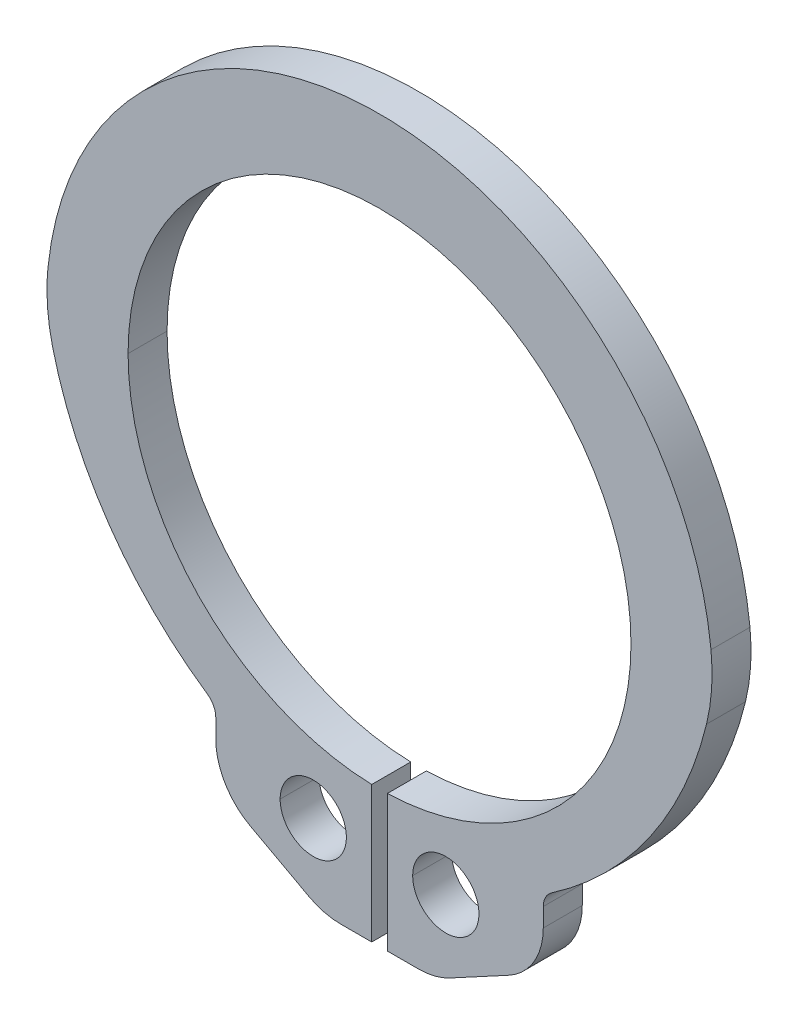
ISO-10303-21;
HEADER;
FILE_DESCRIPTION(('STEP AP214'),'2;1');
FILE_NAME('part.step','',(''),(''),'','','');
FILE_SCHEMA(('AUTOMOTIVE_DESIGN { 1 0 10303 214 1 1 1 1 }'));
ENDSEC;
DATA;
#1=APPLICATION_CONTEXT('core data for automotive mechanical design processes');
#2=APPLICATION_PROTOCOL_DEFINITION('international standard','automotive_design',2000,#1);
#3=PRODUCT_CONTEXT('',#1,'mechanical');
#4=PRODUCT('Part','Part','',(#3));
#5=PRODUCT_RELATED_PRODUCT_CATEGORY('part','',(#4));
#6=PRODUCT_DEFINITION_FORMATION('','',#4);
#7=PRODUCT_DEFINITION_CONTEXT('part definition',#1,'design');
#8=PRODUCT_DEFINITION('design','',#6,#7);
#9=PRODUCT_DEFINITION_SHAPE('','',#8);
#10=(LENGTH_UNIT() NAMED_UNIT(*) SI_UNIT(.MILLI.,.METRE.));
#11=(NAMED_UNIT(*) PLANE_ANGLE_UNIT() SI_UNIT($,.RADIAN.));
#12=(NAMED_UNIT(*) SI_UNIT($,.STERADIAN.) SOLID_ANGLE_UNIT());
#13=UNCERTAINTY_MEASURE_WITH_UNIT(LENGTH_MEASURE(1.E-05),#10,'distance_accuracy_value','');
#14=(GEOMETRIC_REPRESENTATION_CONTEXT(3) GLOBAL_UNCERTAINTY_ASSIGNED_CONTEXT((#13)) GLOBAL_UNIT_ASSIGNED_CONTEXT((#10,
#11,#12)) REPRESENTATION_CONTEXT('',''));
#15=CARTESIAN_POINT('',(0.,0.,0.));
#16=DIRECTION('',(0.,0.,1.));
#17=DIRECTION('',(1.,0.,0.));
#18=AXIS2_PLACEMENT_3D('',#15,#16,#17);
#19=CARTESIAN_POINT('',(0.,0.,-0.5));
#20=DIRECTION('',(0.,0.,1.));
#21=DIRECTION('',(1.,0.,0.));
#22=AXIS2_PLACEMENT_3D('',#19,#20,#21);
#23=PLANE('',#22);
#24=CARTESIAN_POINT('',(1.7,-7.94689847911381,-0.5));
#25=DIRECTION('',(0.,0.,1.));
#26=DIRECTION('',(1.,0.,0.));
#27=AXIS2_PLACEMENT_3D('',#24,#25,#26);
#28=CIRCLE('',#27,0.85);
#29=CARTESIAN_POINT('',(0.85,-7.94689847911381,-0.5));
#30=VERTEX_POINT('',#29);
#31=CARTESIAN_POINT('',(2.55,-7.94689847911381,-0.5));
#32=VERTEX_POINT('',#31);
#33=EDGE_CURVE('E394',#30,#32,#28,.T.);
#34=ORIENTED_EDGE('',*,*,#33,.T.);
#35=CARTESIAN_POINT('',(1.7,-7.94689847911381,-0.5));
#36=DIRECTION('',(0.,0.,1.));
#37=DIRECTION('',(1.,0.,0.));
#38=AXIS2_PLACEMENT_3D('',#35,#36,#37);
#39=CIRCLE('',#38,0.85);
#40=EDGE_CURVE('E322',#32,#30,#39,.T.);
#41=ORIENTED_EDGE('',*,*,#40,.T.);
#42=EDGE_LOOP('',(#34,#41));
#43=FACE_BOUND('',#42,.T.);
#44=CARTESIAN_POINT('',(-1.7,-7.94689847911381,-0.5));
#45=DIRECTION('',(0.,0.,-1.));
#46=DIRECTION('',(1.,0.,0.));
#47=AXIS2_PLACEMENT_3D('',#44,#45,#46);
#48=CIRCLE('',#47,0.85);
#49=CARTESIAN_POINT('',(-2.55,-7.94689847911381,-0.5));
#50=VERTEX_POINT('',#49);
#51=CARTESIAN_POINT('',(-0.85,-7.94689847911381,-0.5));
#52=VERTEX_POINT('',#51);
#53=EDGE_CURVE('E314',#50,#52,#48,.T.);
#54=ORIENTED_EDGE('',*,*,#53,.F.);
#55=CARTESIAN_POINT('',(-1.7,-7.94689847911381,-0.5));
#56=DIRECTION('',(0.,0.,-1.));
#57=DIRECTION('',(1.,0.,0.));
#58=AXIS2_PLACEMENT_3D('',#55,#56,#57);
#59=CIRCLE('',#58,0.85);
#60=EDGE_CURVE('E359',#52,#50,#59,.T.);
#61=ORIENTED_EDGE('',*,*,#60,.F.);
#62=EDGE_LOOP('',(#54,#61));
#63=FACE_BOUND('',#62,.T.);
#64=CARTESIAN_POINT('',(-1.06941400291928,1.49669467886764,-0.5));
#65=DIRECTION('',(0.,0.,1.));
#66=DIRECTION('',(1.,0.,0.));
#67=AXIS2_PLACEMENT_3D('',#64,#65,#66);
#68=CIRCLE('',#67,9.73515386223095);
#69=CARTESIAN_POINT('',(4.41815694807437,-6.54443619801285,-0.5));
#70=VERTEX_POINT('',#69);
#71=CARTESIAN_POINT('',(8.38746597204816,-0.81428819869119,-0.5));
#72=VERTEX_POINT('',#71);
#73=EDGE_CURVE('E364',#70,#72,#68,.T.);
#74=ORIENTED_EDGE('',*,*,#73,.F.);
#75=CARTESIAN_POINT('',(4.7,-6.95743074286937,-0.5));
#76=DIRECTION('',(0.,0.,-1.));
#77=DIRECTION('',(1.,0.,0.));
#78=AXIS2_PLACEMENT_3D('',#75,#76,#77);
#79=CIRCLE('',#78,0.5);
#80=CARTESIAN_POINT('',(4.2,-6.95743074286937,-0.5));
#81=VERTEX_POINT('',#80);
#82=EDGE_CURVE('E24',#81,#70,#79,.T.);
#83=ORIENTED_EDGE('',*,*,#82,.F.);
#84=DIRECTION('',(0.,1.,0.));
#85=VECTOR('',#84,1.);
#86=CARTESIAN_POINT('',(4.2,0.,-0.5));
#87=LINE('',#86,#85);
#88=CARTESIAN_POINT('',(4.2,-7.43585997502488,-0.5));
#89=VERTEX_POINT('',#88);
#90=EDGE_CURVE('E319',#89,#81,#87,.T.);
#91=ORIENTED_EDGE('',*,*,#90,.F.);
#92=CARTESIAN_POINT('',(2.5,-7.43585997502488,-0.5));
#93=DIRECTION('',(0.,0.,1.));
#94=DIRECTION('',(1.,0.,0.));
#95=AXIS2_PLACEMENT_3D('',#92,#93,#94);
#96=CIRCLE('',#95,1.7);
#97=CARTESIAN_POINT('',(3.30807421131127,-8.9315257361539,-0.5));
#98=VERTEX_POINT('',#97);
#99=EDGE_CURVE('E307',#98,#89,#96,.T.);
#100=ORIENTED_EDGE('',*,*,#99,.F.);
#101=DIRECTION('',(0.879803388899425,0.475337771359574,0.));
#102=VECTOR('',#101,1.);
#103=CARTESIAN_POINT('',(4.48264396833991,-8.29693239671387,-0.5));
#104=LINE('',#103,#102);
#105=CARTESIAN_POINT('',(1.80692183626556,-9.74256424024284,-0.5));
#106=VERTEX_POINT('',#105);
#107=EDGE_CURVE('E259',#106,#98,#104,.T.);
#108=ORIENTED_EDGE('',*,*,#107,.F.);
#109=CARTESIAN_POINT('',(0.998847624954278,-8.24689847911381,-0.5));
#110=DIRECTION('',(0.,0.,-1.));
#111=DIRECTION('',(1.,0.,0.));
#112=AXIS2_PLACEMENT_3D('',#109,#110,#111);
#113=CIRCLE('',#112,1.7);
#114=CARTESIAN_POINT('',(0.998847624954278,-9.94689847911382,-0.5));
#115=VERTEX_POINT('',#114);
#116=EDGE_CURVE('E253',#106,#115,#113,.T.);
#117=ORIENTED_EDGE('',*,*,#116,.T.);
#118=DIRECTION('',(1.,0.,0.));
#119=VECTOR('',#118,1.);
#120=CARTESIAN_POINT('',(0.,-9.94689847911382,-0.5));
#121=LINE('',#120,#119);
#122=CARTESIAN_POINT('',(0.2,-9.94689847911382,-0.5));
#123=VERTEX_POINT('',#122);
#124=EDGE_CURVE('E256',#123,#115,#121,.T.);
#125=ORIENTED_EDGE('',*,*,#124,.F.);
#126=DIRECTION('',(0.,-1.,0.));
#127=VECTOR('',#126,1.);
#128=CARTESIAN_POINT('',(0.2,0.,-0.5));
#129=LINE('',#128,#127);
#130=CARTESIAN_POINT('',(0.2,-6.44689847911381,-0.5));
#131=VERTEX_POINT('',#130);
#132=EDGE_CURVE('E294',#131,#123,#129,.T.);
#133=ORIENTED_EDGE('',*,*,#132,.F.);
#134=CARTESIAN_POINT('',(0.,0.,-0.5));
#135=DIRECTION('',(0.,0.,1.));
#136=DIRECTION('',(1.,0.,0.));
#137=AXIS2_PLACEMENT_3D('',#134,#135,#136);
#138=CIRCLE('',#137,6.45);
#139=CARTESIAN_POINT('',(6.45,0.,-0.5));
#140=VERTEX_POINT('',#139);
#141=EDGE_CURVE('E342',#131,#140,#138,.T.);
#142=ORIENTED_EDGE('',*,*,#141,.T.);
#143=CARTESIAN_POINT('',(0.,0.,-0.5));
#144=DIRECTION('',(0.,0.,1.));
#145=DIRECTION('',(1.,0.,0.));
#146=AXIS2_PLACEMENT_3D('',#143,#144,#145);
#147=CIRCLE('',#146,6.45);
#148=CARTESIAN_POINT('',(-6.45,0.,-0.5));
#149=VERTEX_POINT('',#148);
#150=EDGE_CURVE('E381',#140,#149,#147,.T.);
#151=ORIENTED_EDGE('',*,*,#150,.T.);
#152=CARTESIAN_POINT('',(0.,0.,-0.5));
#153=DIRECTION('',(0.,0.,1.));
#154=DIRECTION('',(1.,0.,0.));
#155=AXIS2_PLACEMENT_3D('',#152,#153,#154);
#156=CIRCLE('',#155,6.45);
#157=CARTESIAN_POINT('',(-0.2,-6.44689847911381,-0.5));
#158=VERTEX_POINT('',#157);
#159=EDGE_CURVE('E292',#149,#158,#156,.T.);
#160=ORIENTED_EDGE('',*,*,#159,.T.);
#161=DIRECTION('',(0.,-1.,0.));
#162=VECTOR('',#161,1.);
#163=CARTESIAN_POINT('',(-0.2,0.,-0.5));
#164=LINE('',#163,#162);
#165=CARTESIAN_POINT('',(-0.2,-9.94689847911382,-0.5));
#166=VERTEX_POINT('',#165);
#167=EDGE_CURVE('E529',#158,#166,#164,.T.);
#168=ORIENTED_EDGE('',*,*,#167,.T.);
#169=DIRECTION('',(-1.,0.,0.));
#170=VECTOR('',#169,1.);
#171=CARTESIAN_POINT('',(0.,-9.94689847911382,-0.5));
#172=LINE('',#171,#170);
#173=CARTESIAN_POINT('',(-0.998847624954275,-9.94689847911382,-0.5));
#174=VERTEX_POINT('',#173);
#175=EDGE_CURVE('E405',#166,#174,#172,.T.);
#176=ORIENTED_EDGE('',*,*,#175,.T.);
#177=CARTESIAN_POINT('',(-0.998847624954275,-8.24689847911381,-0.5));
#178=DIRECTION('',(0.,0.,1.));
#179=DIRECTION('',(1.,0.,0.));
#180=AXIS2_PLACEMENT_3D('',#177,#178,#179);
#181=CIRCLE('',#180,1.7);
#182=CARTESIAN_POINT('',(-1.80692183626555,-9.74256424024283,-0.5));
#183=VERTEX_POINT('',#182);
#184=EDGE_CURVE('E375',#183,#174,#181,.T.);
#185=ORIENTED_EDGE('',*,*,#184,.F.);
#186=DIRECTION('',(-0.879803388899425,0.475337771359574,0.));
#187=VECTOR('',#186,1.);
#188=CARTESIAN_POINT('',(-4.48264396833991,-8.29693239671387,-0.5));
#189=LINE('',#188,#187);
#190=CARTESIAN_POINT('',(-3.30807421131127,-8.9315257361539,-0.5));
#191=VERTEX_POINT('',#190);
#192=EDGE_CURVE('E532',#183,#191,#189,.T.);
#193=ORIENTED_EDGE('',*,*,#192,.T.);
#194=CARTESIAN_POINT('',(-2.5,-7.43585997502488,-0.5));
#195=DIRECTION('',(0.,0.,-1.));
#196=DIRECTION('',(1.,0.,0.));
#197=AXIS2_PLACEMENT_3D('',#194,#195,#196);
#198=CIRCLE('',#197,1.7);
#199=CARTESIAN_POINT('',(-4.2,-7.43585997502488,-0.5));
#200=VERTEX_POINT('',#199);
#201=EDGE_CURVE('E513',#191,#200,#198,.T.);
#202=ORIENTED_EDGE('',*,*,#201,.T.);
#203=DIRECTION('',(0.,1.,0.));
#204=VECTOR('',#203,1.);
#205=CARTESIAN_POINT('',(-4.2,0.,-0.5));
#206=LINE('',#205,#204);
#207=CARTESIAN_POINT('',(-4.2,-6.95743074286937,-0.5));
#208=VERTEX_POINT('',#207);
#209=EDGE_CURVE('E503',#200,#208,#206,.T.);
#210=ORIENTED_EDGE('',*,*,#209,.T.);
#211=CARTESIAN_POINT('',(-4.7,-6.95743074286937,-0.5));
#212=DIRECTION('',(0.,0.,1.));
#213=DIRECTION('',(1.,0.,0.));
#214=AXIS2_PLACEMENT_3D('',#211,#212,#213);
#215=CIRCLE('',#214,0.5);
#216=CARTESIAN_POINT('',(-4.41815694807437,-6.54443619801285,-0.5));
#217=VERTEX_POINT('',#216);
#218=EDGE_CURVE('E448',#208,#217,#215,.T.);
#219=ORIENTED_EDGE('',*,*,#218,.T.);
#220=CARTESIAN_POINT('',(1.06941400291928,1.49669467886764,-0.5));
#221=DIRECTION('',(0.,0.,-1.));
#222=DIRECTION('',(1.,0.,0.));
#223=AXIS2_PLACEMENT_3D('',#220,#221,#222);
#224=CIRCLE('',#223,9.73515386223095);
#225=CARTESIAN_POINT('',(-8.38746597204816,-0.81428819869119,-0.5));
#226=VERTEX_POINT('',#225);
#227=EDGE_CURVE('E479',#217,#226,#224,.T.);
#228=ORIENTED_EDGE('',*,*,#227,.T.);
#229=CARTESIAN_POINT('',(-3.53038815448182,0.372638536244481,-0.5));
#230=DIRECTION('',(0.,0.,-1.));
#231=DIRECTION('',(1.,0.,0.));
#232=AXIS2_PLACEMENT_3D('',#229,#230,#231);
#233=CIRCLE('',#232,5.);
#234=CARTESIAN_POINT('',(-8.53038815448182,0.372638536244481,-0.5));
#235=VERTEX_POINT('',#234);
#236=EDGE_CURVE('E365',#226,#235,#233,.T.);
#237=ORIENTED_EDGE('',*,*,#236,.T.);
#238=CARTESIAN_POINT('',(-3.53038815448182,0.372638536244481,-0.5));
#239=DIRECTION('',(0.,0.,-1.));
#240=DIRECTION('',(1.,0.,0.));
#241=AXIS2_PLACEMENT_3D('',#238,#239,#240);
#242=CIRCLE('',#241,5.);
#243=CARTESIAN_POINT('',(-8.50276583685059,0.897481545039524,-0.5));
#244=VERTEX_POINT('',#243);
#245=EDGE_CURVE('E476',#235,#244,#242,.T.);
#246=ORIENTED_EDGE('',*,*,#245,.T.);
#247=CARTESIAN_POINT('',(0.,0.,-0.5));
#248=DIRECTION('',(0.,0.,1.));
#249=DIRECTION('',(1.,0.,0.));
#250=AXIS2_PLACEMENT_3D('',#247,#248,#249);
#251=CIRCLE('',#250,8.55);
#252=CARTESIAN_POINT('',(8.50276583685059,0.897481545039527,-0.5));
#253=VERTEX_POINT('',#252);
#254=EDGE_CURVE('E467',#253,#244,#251,.T.);
#255=ORIENTED_EDGE('',*,*,#254,.F.);
#256=CARTESIAN_POINT('',(3.53038815448182,0.372638536244482,-0.5));
#257=DIRECTION('',(0.,0.,1.));
#258=DIRECTION('',(1.,0.,0.));
#259=AXIS2_PLACEMENT_3D('',#256,#257,#258);
#260=CIRCLE('',#259,5.);
#261=EDGE_CURVE('E447',#72,#253,#260,.T.);
#262=ORIENTED_EDGE('',*,*,#261,.F.);
#263=EDGE_LOOP('',(#74,#83,#91,#100,#108,#117,#125,#133,#142,#151,#160,#168,#176,#185,#193,#202,
#210,#219,#228,#237,#246,#255,#262));
#264=FACE_BOUND('',#263,.T.);
#265=ADVANCED_FACE('F16',(#43,#63,#264),#23,.F.);
#266=CARTESIAN_POINT('',(0.,0.,0.5));
#267=DIRECTION('',(0.,0.,1.));
#268=DIRECTION('',(1.,0.,0.));
#269=AXIS2_PLACEMENT_3D('',#266,#267,#268);
#270=PLANE('',#269);
#271=CARTESIAN_POINT('',(1.7,-7.94689847911381,0.5));
#272=DIRECTION('',(0.,0.,1.));
#273=DIRECTION('',(1.,0.,0.));
#274=AXIS2_PLACEMENT_3D('',#271,#272,#273);
#275=CIRCLE('',#274,0.85);
#276=CARTESIAN_POINT('',(0.85,-7.94689847911381,0.5));
#277=VERTEX_POINT('',#276);
#278=CARTESIAN_POINT('',(2.55,-7.94689847911381,0.5));
#279=VERTEX_POINT('',#278);
#280=EDGE_CURVE('E366',#277,#279,#275,.T.);
#281=ORIENTED_EDGE('',*,*,#280,.F.);
#282=CARTESIAN_POINT('',(1.7,-7.94689847911381,0.5));
#283=DIRECTION('',(0.,0.,1.));
#284=DIRECTION('',(1.,0.,0.));
#285=AXIS2_PLACEMENT_3D('',#282,#283,#284);
#286=CIRCLE('',#285,0.85);
#287=EDGE_CURVE('E320',#279,#277,#286,.T.);
#288=ORIENTED_EDGE('',*,*,#287,.F.);
#289=EDGE_LOOP('',(#281,#288));
#290=FACE_BOUND('',#289,.T.);
#291=CARTESIAN_POINT('',(-1.7,-7.94689847911381,0.5));
#292=DIRECTION('',(0.,0.,-1.));
#293=DIRECTION('',(1.,0.,0.));
#294=AXIS2_PLACEMENT_3D('',#291,#292,#293);
#295=CIRCLE('',#294,0.85);
#296=CARTESIAN_POINT('',(-2.55,-7.94689847911381,0.5));
#297=VERTEX_POINT('',#296);
#298=CARTESIAN_POINT('',(-0.85,-7.94689847911381,0.5));
#299=VERTEX_POINT('',#298);
#300=EDGE_CURVE('E325',#297,#299,#295,.T.);
#301=ORIENTED_EDGE('',*,*,#300,.T.);
#302=CARTESIAN_POINT('',(-1.7,-7.94689847911381,0.5));
#303=DIRECTION('',(0.,0.,-1.));
#304=DIRECTION('',(1.,0.,0.));
#305=AXIS2_PLACEMENT_3D('',#302,#303,#304);
#306=CIRCLE('',#305,0.85);
#307=EDGE_CURVE('E347',#299,#297,#306,.T.);
#308=ORIENTED_EDGE('',*,*,#307,.T.);
#309=EDGE_LOOP('',(#301,#308));
#310=FACE_BOUND('',#309,.T.);
#311=CARTESIAN_POINT('',(-1.06941400291928,1.49669467886764,0.5));
#312=DIRECTION('',(0.,0.,1.));
#313=DIRECTION('',(1.,0.,0.));
#314=AXIS2_PLACEMENT_3D('',#311,#312,#313);
#315=CIRCLE('',#314,9.73515386223095);
#316=CARTESIAN_POINT('',(4.41815694807437,-6.54443619801285,0.5));
#317=VERTEX_POINT('',#316);
#318=CARTESIAN_POINT('',(8.38746597204816,-0.81428819869119,0.5));
#319=VERTEX_POINT('',#318);
#320=EDGE_CURVE('E439',#317,#319,#315,.T.);
#321=ORIENTED_EDGE('',*,*,#320,.T.);
#322=CARTESIAN_POINT('',(3.53038815448182,0.372638536244482,0.5));
#323=DIRECTION('',(0.,0.,1.));
#324=DIRECTION('',(1.,0.,0.));
#325=AXIS2_PLACEMENT_3D('',#322,#323,#324);
#326=CIRCLE('',#325,5.);
#327=CARTESIAN_POINT('',(8.50276583685059,0.897481545039527,0.5));
#328=VERTEX_POINT('',#327);
#329=EDGE_CURVE('E463',#319,#328,#326,.T.);
#330=ORIENTED_EDGE('',*,*,#329,.T.);
#331=CARTESIAN_POINT('',(0.,0.,0.5));
#332=DIRECTION('',(0.,0.,1.));
#333=DIRECTION('',(1.,0.,0.));
#334=AXIS2_PLACEMENT_3D('',#331,#332,#333);
#335=CIRCLE('',#334,8.55);
#336=CARTESIAN_POINT('',(-8.50276583685059,0.897481545039524,0.5));
#337=VERTEX_POINT('',#336);
#338=EDGE_CURVE('E475',#328,#337,#335,.T.);
#339=ORIENTED_EDGE('',*,*,#338,.T.);
#340=CARTESIAN_POINT('',(-3.53038815448182,0.372638536244481,0.5));
#341=DIRECTION('',(0.,0.,-1.));
#342=DIRECTION('',(1.,0.,0.));
#343=AXIS2_PLACEMENT_3D('',#340,#341,#342);
#344=CIRCLE('',#343,5.);
#345=CARTESIAN_POINT('',(-8.53038815448182,0.372638536244481,0.5));
#346=VERTEX_POINT('',#345);
#347=EDGE_CURVE('E480',#346,#337,#344,.T.);
#348=ORIENTED_EDGE('',*,*,#347,.F.);
#349=CARTESIAN_POINT('',(-3.53038815448182,0.372638536244481,0.5));
#350=DIRECTION('',(0.,0.,-1.));
#351=DIRECTION('',(1.,0.,0.));
#352=AXIS2_PLACEMENT_3D('',#349,#350,#351);
#353=CIRCLE('',#352,5.);
#354=CARTESIAN_POINT('',(-8.38746597204816,-0.81428819869119,0.5));
#355=VERTEX_POINT('',#354);
#356=EDGE_CURVE('E385',#355,#346,#353,.T.);
#357=ORIENTED_EDGE('',*,*,#356,.F.);
#358=CARTESIAN_POINT('',(1.06941400291928,1.49669467886764,0.5));
#359=DIRECTION('',(0.,0.,-1.));
#360=DIRECTION('',(1.,0.,0.));
#361=AXIS2_PLACEMENT_3D('',#358,#359,#360);
#362=CIRCLE('',#361,9.73515386223095);
#363=CARTESIAN_POINT('',(-4.41815694807437,-6.54443619801285,0.5));
#364=VERTEX_POINT('',#363);
#365=EDGE_CURVE('E452',#364,#355,#362,.T.);
#366=ORIENTED_EDGE('',*,*,#365,.F.);
#367=CARTESIAN_POINT('',(-4.7,-6.95743074286937,0.5));
#368=DIRECTION('',(0.,0.,1.));
#369=DIRECTION('',(1.,0.,0.));
#370=AXIS2_PLACEMENT_3D('',#367,#368,#369);
#371=CIRCLE('',#370,0.5);
#372=CARTESIAN_POINT('',(-4.2,-6.95743074286937,0.5));
#373=VERTEX_POINT('',#372);
#374=EDGE_CURVE('E497',#373,#364,#371,.T.);
#375=ORIENTED_EDGE('',*,*,#374,.F.);
#376=DIRECTION('',(0.,1.,0.));
#377=VECTOR('',#376,1.);
#378=CARTESIAN_POINT('',(-4.2,0.,0.5));
#379=LINE('',#378,#377);
#380=CARTESIAN_POINT('',(-4.2,-7.43585997502488,0.5));
#381=VERTEX_POINT('',#380);
#382=EDGE_CURVE('E510',#381,#373,#379,.T.);
#383=ORIENTED_EDGE('',*,*,#382,.F.);
#384=CARTESIAN_POINT('',(-2.5,-7.43585997502488,0.5));
#385=DIRECTION('',(0.,0.,-1.));
#386=DIRECTION('',(1.,0.,0.));
#387=AXIS2_PLACEMENT_3D('',#384,#385,#386);
#388=CIRCLE('',#387,1.7);
#389=CARTESIAN_POINT('',(-3.30807421131127,-8.9315257361539,0.5));
#390=VERTEX_POINT('',#389);
#391=EDGE_CURVE('E525',#390,#381,#388,.T.);
#392=ORIENTED_EDGE('',*,*,#391,.F.);
#393=DIRECTION('',(-0.879803388899425,0.475337771359574,0.));
#394=VECTOR('',#393,1.);
#395=CARTESIAN_POINT('',(-4.48264396833991,-8.29693239671387,0.5));
#396=LINE('',#395,#394);
#397=CARTESIAN_POINT('',(-1.80692183626555,-9.74256424024283,0.5));
#398=VERTEX_POINT('',#397);
#399=EDGE_CURVE('E380',#398,#390,#396,.T.);
#400=ORIENTED_EDGE('',*,*,#399,.F.);
#401=CARTESIAN_POINT('',(-0.998847624954275,-8.24689847911381,0.5));
#402=DIRECTION('',(0.,0.,1.));
#403=DIRECTION('',(1.,0.,0.));
#404=AXIS2_PLACEMENT_3D('',#401,#402,#403);
#405=CIRCLE('',#404,1.7);
#406=CARTESIAN_POINT('',(-0.998847624954275,-9.94689847911382,0.5));
#407=VERTEX_POINT('',#406);
#408=EDGE_CURVE('E401',#398,#407,#405,.T.);
#409=ORIENTED_EDGE('',*,*,#408,.T.);
#410=DIRECTION('',(-1.,0.,0.));
#411=VECTOR('',#410,1.);
#412=CARTESIAN_POINT('',(0.,-9.94689847911382,0.5));
#413=LINE('',#412,#411);
#414=CARTESIAN_POINT('',(-0.2,-9.94689847911382,0.5));
#415=VERTEX_POINT('',#414);
#416=EDGE_CURVE('E554',#415,#407,#413,.T.);
#417=ORIENTED_EDGE('',*,*,#416,.F.);
#418=DIRECTION('',(0.,-1.,0.));
#419=VECTOR('',#418,1.);
#420=CARTESIAN_POINT('',(-0.2,0.,0.5));
#421=LINE('',#420,#419);
#422=CARTESIAN_POINT('',(-0.2,-6.44689847911381,0.5));
#423=VERTEX_POINT('',#422);
#424=EDGE_CURVE('E517',#423,#415,#421,.T.);
#425=ORIENTED_EDGE('',*,*,#424,.F.);
#426=CARTESIAN_POINT('',(0.,0.,0.5));
#427=DIRECTION('',(0.,0.,1.));
#428=DIRECTION('',(1.,0.,0.));
#429=AXIS2_PLACEMENT_3D('',#426,#427,#428);
#430=CIRCLE('',#429,6.45);
#431=CARTESIAN_POINT('',(-6.45,0.,0.5));
#432=VERTEX_POINT('',#431);
#433=EDGE_CURVE('E520',#432,#423,#430,.T.);
#434=ORIENTED_EDGE('',*,*,#433,.F.);
#435=CARTESIAN_POINT('',(0.,0.,0.5));
#436=DIRECTION('',(0.,0.,1.));
#437=DIRECTION('',(1.,0.,0.));
#438=AXIS2_PLACEMENT_3D('',#435,#436,#437);
#439=CIRCLE('',#438,6.45);
#440=CARTESIAN_POINT('',(6.45,0.,0.5));
#441=VERTEX_POINT('',#440);
#442=EDGE_CURVE('E414',#441,#432,#439,.T.);
#443=ORIENTED_EDGE('',*,*,#442,.F.);
#444=CARTESIAN_POINT('',(0.,0.,0.5));
#445=DIRECTION('',(0.,0.,1.));
#446=DIRECTION('',(1.,0.,0.));
#447=AXIS2_PLACEMENT_3D('',#444,#445,#446);
#448=CIRCLE('',#447,6.45);
#449=CARTESIAN_POINT('',(0.2,-6.44689847911381,0.5));
#450=VERTEX_POINT('',#449);
#451=EDGE_CURVE('E351',#450,#441,#448,.T.);
#452=ORIENTED_EDGE('',*,*,#451,.F.);
#453=DIRECTION('',(0.,-1.,0.));
#454=VECTOR('',#453,1.);
#455=CARTESIAN_POINT('',(0.2,0.,0.5));
#456=LINE('',#455,#454);
#457=CARTESIAN_POINT('',(0.2,-9.94689847911382,0.5));
#458=VERTEX_POINT('',#457);
#459=EDGE_CURVE('E281',#450,#458,#456,.T.);
#460=ORIENTED_EDGE('',*,*,#459,.T.);
#461=DIRECTION('',(1.,0.,0.));
#462=VECTOR('',#461,1.);
#463=CARTESIAN_POINT('',(0.,-9.94689847911382,0.5));
#464=LINE('',#463,#462);
#465=CARTESIAN_POINT('',(0.998847624954278,-9.94689847911382,0.5));
#466=VERTEX_POINT('',#465);
#467=EDGE_CURVE('E265',#458,#466,#464,.T.);
#468=ORIENTED_EDGE('',*,*,#467,.T.);
#469=CARTESIAN_POINT('',(0.998847624954278,-8.24689847911381,0.5));
#470=DIRECTION('',(0.,0.,-1.));
#471=DIRECTION('',(1.,0.,0.));
#472=AXIS2_PLACEMENT_3D('',#469,#470,#471);
#473=CIRCLE('',#472,1.7);
#474=CARTESIAN_POINT('',(1.80692183626556,-9.74256424024284,0.5));
#475=VERTEX_POINT('',#474);
#476=EDGE_CURVE('E271',#475,#466,#473,.T.);
#477=ORIENTED_EDGE('',*,*,#476,.F.);
#478=DIRECTION('',(0.879803388899425,0.475337771359574,0.));
#479=VECTOR('',#478,1.);
#480=CARTESIAN_POINT('',(4.48264396833991,-8.29693239671387,0.5));
#481=LINE('',#480,#479);
#482=CARTESIAN_POINT('',(3.30807421131127,-8.9315257361539,0.5));
#483=VERTEX_POINT('',#482);
#484=EDGE_CURVE('E303',#475,#483,#481,.T.);
#485=ORIENTED_EDGE('',*,*,#484,.T.);
#486=CARTESIAN_POINT('',(2.5,-7.43585997502488,0.5));
#487=DIRECTION('',(0.,0.,1.));
#488=DIRECTION('',(1.,0.,0.));
#489=AXIS2_PLACEMENT_3D('',#486,#487,#488);
#490=CIRCLE('',#489,1.7);
#491=CARTESIAN_POINT('',(4.2,-7.43585997502488,0.5));
#492=VERTEX_POINT('',#491);
#493=EDGE_CURVE('E315',#483,#492,#490,.T.);
#494=ORIENTED_EDGE('',*,*,#493,.T.);
#495=DIRECTION('',(0.,1.,0.));
#496=VECTOR('',#495,1.);
#497=CARTESIAN_POINT('',(4.2,0.,0.5));
#498=LINE('',#497,#496);
#499=CARTESIAN_POINT('',(4.2,-6.95743074286937,0.5));
#500=VERTEX_POINT('',#499);
#501=EDGE_CURVE('E323',#492,#500,#498,.T.);
#502=ORIENTED_EDGE('',*,*,#501,.T.);
#503=CARTESIAN_POINT('',(4.7,-6.95743074286937,0.5));
#504=DIRECTION('',(0.,0.,-1.));
#505=DIRECTION('',(1.,0.,0.));
#506=AXIS2_PLACEMENT_3D('',#503,#504,#505);
#507=CIRCLE('',#506,0.5);
#508=EDGE_CURVE('E10',#500,#317,#507,.T.);
#509=ORIENTED_EDGE('',*,*,#508,.T.);
#510=EDGE_LOOP('',(#321,#330,#339,#348,#357,#366,#375,#383,#392,#400,#409,#417,#425,#434,#443,
#452,#460,#468,#477,#485,#494,#502,#509));
#511=FACE_BOUND('',#510,.T.);
#512=ADVANCED_FACE('F574',(#290,#310,#511),#270,.T.);
#513=CARTESIAN_POINT('',(4.7,-6.95743074286937,0.5));
#514=DIRECTION('',(0.,0.,-1.));
#515=DIRECTION('',(-1.,0.,0.));
#516=AXIS2_PLACEMENT_3D('',#513,#514,#515);
#517=CYLINDRICAL_SURFACE('',#516,0.5);
#518=ORIENTED_EDGE('',*,*,#82,.T.);
#519=DIRECTION('',(0.,0.,-1.));
#520=VECTOR('',#519,1.);
#521=CARTESIAN_POINT('',(4.41815694807437,-6.54443619801285,0.5));
#522=LINE('',#521,#520);
#523=EDGE_CURVE('E443',#317,#70,#522,.T.);
#524=ORIENTED_EDGE('',*,*,#523,.F.);
#525=ORIENTED_EDGE('',*,*,#508,.F.);
#526=DIRECTION('',(0.,0.,-1.));
#527=VECTOR('',#526,1.);
#528=CARTESIAN_POINT('',(4.2,-6.95743074286937,0.5));
#529=LINE('',#528,#527);
#530=EDGE_CURVE('E398',#500,#81,#529,.T.);
#531=ORIENTED_EDGE('',*,*,#530,.T.);
#532=EDGE_LOOP('',(#518,#524,#525,#531));
#533=FACE_BOUND('',#532,.T.);
#534=ADVANCED_FACE('F645',(#533),#517,.F.);
#535=CARTESIAN_POINT('',(-1.7,-7.94689847911381,0.5));
#536=DIRECTION('',(0.,0.,-1.));
#537=DIRECTION('',(-1.,0.,0.));
#538=AXIS2_PLACEMENT_3D('',#535,#536,#537);
#539=CYLINDRICAL_SURFACE('',#538,0.85);
#540=DIRECTION('',(0.,0.,-1.));
#541=VECTOR('',#540,1.);
#542=CARTESIAN_POINT('',(-0.85,-7.94689847911381,0.5));
#543=LINE('',#542,#541);
#544=EDGE_CURVE('E350',#299,#52,#543,.T.);
#545=ORIENTED_EDGE('',*,*,#544,.F.);
#546=ORIENTED_EDGE('',*,*,#300,.F.);
#547=DIRECTION('',(0.,0.,-1.));
#548=VECTOR('',#547,1.);
#549=CARTESIAN_POINT('',(-2.55,-7.94689847911381,0.5));
#550=LINE('',#549,#548);
#551=EDGE_CURVE('E371',#297,#50,#550,.T.);
#552=ORIENTED_EDGE('',*,*,#551,.T.);
#553=ORIENTED_EDGE('',*,*,#53,.T.);
#554=EDGE_LOOP('',(#545,#546,#552,#553));
#555=FACE_BOUND('',#554,.T.);
#556=ADVANCED_FACE('F640',(#555),#539,.F.);
#557=CARTESIAN_POINT('',(1.7,-7.94689847911381,0.5));
#558=DIRECTION('',(0.,0.,-1.));
#559=DIRECTION('',(-1.,0.,0.));
#560=AXIS2_PLACEMENT_3D('',#557,#558,#559);
#561=CYLINDRICAL_SURFACE('',#560,0.85);
#562=DIRECTION('',(0.,0.,-1.));
#563=VECTOR('',#562,1.);
#564=CARTESIAN_POINT('',(2.55,-7.94689847911381,0.5));
#565=LINE('',#564,#563);
#566=EDGE_CURVE('E370',#279,#32,#565,.T.);
#567=ORIENTED_EDGE('',*,*,#566,.F.);
#568=ORIENTED_EDGE('',*,*,#287,.T.);
#569=DIRECTION('',(0.,0.,-1.));
#570=VECTOR('',#569,1.);
#571=CARTESIAN_POINT('',(0.85,-7.94689847911381,0.5));
#572=LINE('',#571,#570);
#573=EDGE_CURVE('E355',#277,#30,#572,.T.);
#574=ORIENTED_EDGE('',*,*,#573,.T.);
#575=ORIENTED_EDGE('',*,*,#40,.F.);
#576=EDGE_LOOP('',(#567,#568,#574,#575));
#577=FACE_BOUND('',#576,.T.);
#578=ADVANCED_FACE('F644',(#577),#561,.F.);
#579=CARTESIAN_POINT('',(4.2,0.,0.5));
#580=DIRECTION('',(-1.,0.,0.));
#581=DIRECTION('',(0.,0.,1.));
#582=AXIS2_PLACEMENT_3D('',#579,#580,#581);
#583=PLANE('',#582);
#584=ORIENTED_EDGE('',*,*,#90,.T.);
#585=ORIENTED_EDGE('',*,*,#530,.F.);
#586=ORIENTED_EDGE('',*,*,#501,.F.);
#587=DIRECTION('',(0.,0.,-1.));
#588=VECTOR('',#587,1.);
#589=CARTESIAN_POINT('',(4.2,-7.43585997502488,0.5));
#590=LINE('',#589,#588);
#591=EDGE_CURVE('E311',#492,#89,#590,.T.);
#592=ORIENTED_EDGE('',*,*,#591,.T.);
#593=EDGE_LOOP('',(#584,#585,#586,#592));
#594=FACE_BOUND('',#593,.T.);
#595=ADVANCED_FACE('F566',(#594),#583,.F.);
#596=CARTESIAN_POINT('',(2.5,-7.43585997502488,0.5));
#597=DIRECTION('',(0.,0.,-1.));
#598=DIRECTION('',(-1.,0.,0.));
#599=AXIS2_PLACEMENT_3D('',#596,#597,#598);
#600=CYLINDRICAL_SURFACE('',#599,1.7);
#601=ORIENTED_EDGE('',*,*,#99,.T.);
#602=ORIENTED_EDGE('',*,*,#591,.F.);
#603=ORIENTED_EDGE('',*,*,#493,.F.);
#604=DIRECTION('',(0.,0.,-1.));
#605=VECTOR('',#604,1.);
#606=CARTESIAN_POINT('',(3.30807421131127,-8.9315257361539,0.5));
#607=LINE('',#606,#605);
#608=EDGE_CURVE('E302',#483,#98,#607,.T.);
#609=ORIENTED_EDGE('',*,*,#608,.T.);
#610=EDGE_LOOP('',(#601,#602,#603,#609));
#611=FACE_BOUND('',#610,.T.);
#612=ADVANCED_FACE('F570',(#611),#600,.T.);
#613=CARTESIAN_POINT('',(4.48264396833991,-8.29693239671387,0.5));
#614=DIRECTION('',(-0.475337771359574,0.879803388899425,0.));
#615=DIRECTION('',(0.,0.,1.));
#616=AXIS2_PLACEMENT_3D('',#613,#614,#615);
#617=PLANE('',#616);
#618=ORIENTED_EDGE('',*,*,#107,.T.);
#619=ORIENTED_EDGE('',*,*,#608,.F.);
#620=ORIENTED_EDGE('',*,*,#484,.F.);
#621=DIRECTION('',(0.,0.,-1.));
#622=VECTOR('',#621,1.);
#623=CARTESIAN_POINT('',(1.80692183626556,-9.74256424024284,0.5));
#624=LINE('',#623,#622);
#625=EDGE_CURVE('E264',#475,#106,#624,.T.);
#626=ORIENTED_EDGE('',*,*,#625,.T.);
#627=EDGE_LOOP('',(#618,#619,#620,#626));
#628=FACE_BOUND('',#627,.T.);
#629=ADVANCED_FACE('F572',(#628),#617,.F.);
#630=CARTESIAN_POINT('',(0.998847624954278,-8.24689847911381,0.5));
#631=DIRECTION('',(0.,0.,-1.));
#632=DIRECTION('',(-1.,0.,0.));
#633=AXIS2_PLACEMENT_3D('',#630,#631,#632);
#634=CYLINDRICAL_SURFACE('',#633,1.7);
#635=ORIENTED_EDGE('',*,*,#116,.F.);
#636=ORIENTED_EDGE('',*,*,#625,.F.);
#637=ORIENTED_EDGE('',*,*,#476,.T.);
#638=DIRECTION('',(0.,0.,-1.));
#639=VECTOR('',#638,1.);
#640=CARTESIAN_POINT('',(0.998847624954278,-9.94689847911382,0.5));
#641=LINE('',#640,#639);
#642=EDGE_CURVE('E268',#466,#115,#641,.T.);
#643=ORIENTED_EDGE('',*,*,#642,.T.);
#644=EDGE_LOOP('',(#635,#636,#637,#643));
#645=FACE_BOUND('',#644,.T.);
#646=ADVANCED_FACE('F269',(#645),#634,.T.);
#647=CARTESIAN_POINT('',(0.,-9.94689847911382,0.5));
#648=DIRECTION('',(0.,1.,0.));
#649=DIRECTION('',(1.,0.,0.));
#650=AXIS2_PLACEMENT_3D('',#647,#648,#649);
#651=PLANE('',#650);
#652=ORIENTED_EDGE('',*,*,#124,.T.);
#653=ORIENTED_EDGE('',*,*,#642,.F.);
#654=ORIENTED_EDGE('',*,*,#467,.F.);
#655=DIRECTION('',(0.,0.,-1.));
#656=VECTOR('',#655,1.);
#657=CARTESIAN_POINT('',(0.2,-9.94689847911382,0.5));
#658=LINE('',#657,#656);
#659=EDGE_CURVE('E278',#458,#123,#658,.T.);
#660=ORIENTED_EDGE('',*,*,#659,.T.);
#661=EDGE_LOOP('',(#652,#653,#654,#660));
#662=FACE_BOUND('',#661,.T.);
#663=ADVANCED_FACE('F276',(#662),#651,.F.);
#664=CARTESIAN_POINT('',(0.2,0.,0.5));
#665=DIRECTION('',(1.,0.,0.));
#666=DIRECTION('',(0.,1.,0.));
#667=AXIS2_PLACEMENT_3D('',#664,#665,#666);
#668=PLANE('',#667);
#669=ORIENTED_EDGE('',*,*,#132,.T.);
#670=ORIENTED_EDGE('',*,*,#659,.F.);
#671=ORIENTED_EDGE('',*,*,#459,.F.);
#672=DIRECTION('',(0.,0.,-1.));
#673=VECTOR('',#672,1.);
#674=CARTESIAN_POINT('',(0.2,-6.44689847911381,0.5));
#675=LINE('',#674,#673);
#676=EDGE_CURVE('E345',#450,#131,#675,.T.);
#677=ORIENTED_EDGE('',*,*,#676,.T.);
#678=EDGE_LOOP('',(#669,#670,#671,#677));
#679=FACE_BOUND('',#678,.T.);
#680=ADVANCED_FACE('F578',(#679),#668,.F.);
#681=CARTESIAN_POINT('',(0.,0.,0.5));
#682=DIRECTION('',(0.,0.,-1.));
#683=DIRECTION('',(-1.,0.,0.));
#684=AXIS2_PLACEMENT_3D('',#681,#682,#683);
#685=CYLINDRICAL_SURFACE('',#684,6.45);
#686=DIRECTION('',(0.,0.,-1.));
#687=VECTOR('',#686,1.);
#688=CARTESIAN_POINT('',(-6.45,0.,0.5));
#689=LINE('',#688,#687);
#690=EDGE_CURVE('E386',#432,#149,#689,.T.);
#691=ORIENTED_EDGE('',*,*,#690,.F.);
#692=ORIENTED_EDGE('',*,*,#433,.T.);
#693=DIRECTION('',(0.,0.,-1.));
#694=VECTOR('',#693,1.);
#695=CARTESIAN_POINT('',(-0.2,-6.44689847911381,0.5));
#696=LINE('',#695,#694);
#697=EDGE_CURVE('E521',#423,#158,#696,.T.);
#698=ORIENTED_EDGE('',*,*,#697,.T.);
#699=ORIENTED_EDGE('',*,*,#159,.F.);
#700=EDGE_LOOP('',(#691,#692,#698,#699));
#701=FACE_BOUND('',#700,.T.);
#702=ADVANCED_FACE('F587',(#701),#685,.F.);
#703=CARTESIAN_POINT('',(-0.2,0.,0.5));
#704=DIRECTION('',(1.,0.,0.));
#705=DIRECTION('',(0.,1.,0.));
#706=AXIS2_PLACEMENT_3D('',#703,#704,#705);
#707=PLANE('',#706);
#708=ORIENTED_EDGE('',*,*,#167,.F.);
#709=ORIENTED_EDGE('',*,*,#697,.F.);
#710=ORIENTED_EDGE('',*,*,#424,.T.);
#711=DIRECTION('',(0.,0.,-1.));
#712=VECTOR('',#711,1.);
#713=CARTESIAN_POINT('',(-0.2,-9.94689847911382,0.5));
#714=LINE('',#713,#712);
#715=EDGE_CURVE('E546',#415,#166,#714,.T.);
#716=ORIENTED_EDGE('',*,*,#715,.T.);
#717=EDGE_LOOP('',(#708,#709,#710,#716));
#718=FACE_BOUND('',#717,.T.);
#719=ADVANCED_FACE('F785',(#718),#707,.T.);
#720=CARTESIAN_POINT('',(0.,-9.94689847911382,0.5));
#721=DIRECTION('',(0.,-1.,0.));
#722=DIRECTION('',(0.,0.,-1.));
#723=AXIS2_PLACEMENT_3D('',#720,#721,#722);
#724=PLANE('',#723);
#725=ORIENTED_EDGE('',*,*,#175,.F.);
#726=ORIENTED_EDGE('',*,*,#715,.F.);
#727=ORIENTED_EDGE('',*,*,#416,.T.);
#728=DIRECTION('',(0.,0.,-1.));
#729=VECTOR('',#728,1.);
#730=CARTESIAN_POINT('',(-0.998847624954275,-9.94689847911382,0.5));
#731=LINE('',#730,#729);
#732=EDGE_CURVE('E379',#407,#174,#731,.T.);
#733=ORIENTED_EDGE('',*,*,#732,.T.);
#734=EDGE_LOOP('',(#725,#726,#727,#733));
#735=FACE_BOUND('',#734,.T.);
#736=ADVANCED_FACE('F776',(#735),#724,.T.);
#737=CARTESIAN_POINT('',(-0.998847624954275,-8.24689847911381,0.5));
#738=DIRECTION('',(0.,0.,-1.));
#739=DIRECTION('',(-1.,0.,0.));
#740=AXIS2_PLACEMENT_3D('',#737,#738,#739);
#741=CYLINDRICAL_SURFACE('',#740,1.7);
#742=ORIENTED_EDGE('',*,*,#184,.T.);
#743=ORIENTED_EDGE('',*,*,#732,.F.);
#744=ORIENTED_EDGE('',*,*,#408,.F.);
#745=DIRECTION('',(0.,0.,-1.));
#746=VECTOR('',#745,1.);
#747=CARTESIAN_POINT('',(-1.80692183626555,-9.74256424024283,0.5));
#748=LINE('',#747,#746);
#749=EDGE_CURVE('E535',#398,#183,#748,.T.);
#750=ORIENTED_EDGE('',*,*,#749,.T.);
#751=EDGE_LOOP('',(#742,#743,#744,#750));
#752=FACE_BOUND('',#751,.T.);
#753=ADVANCED_FACE('F743',(#752),#741,.T.);
#754=CARTESIAN_POINT('',(-4.48264396833991,-8.29693239671387,0.5));
#755=DIRECTION('',(-0.475337771359574,-0.879803388899425,0.));
#756=DIRECTION('',(-0.879803388899425,0.475337771359574,0.));
#757=AXIS2_PLACEMENT_3D('',#754,#755,#756);
#758=PLANE('',#757);
#759=ORIENTED_EDGE('',*,*,#192,.F.);
#760=ORIENTED_EDGE('',*,*,#749,.F.);
#761=ORIENTED_EDGE('',*,*,#399,.T.);
#762=DIRECTION('',(0.,0.,-1.));
#763=VECTOR('',#762,1.);
#764=CARTESIAN_POINT('',(-3.30807421131127,-8.9315257361539,0.5));
#765=LINE('',#764,#763);
#766=EDGE_CURVE('E516',#390,#191,#765,.T.);
#767=ORIENTED_EDGE('',*,*,#766,.T.);
#768=EDGE_LOOP('',(#759,#760,#761,#767));
#769=FACE_BOUND('',#768,.T.);
#770=ADVANCED_FACE('F738',(#769),#758,.T.);
#771=CARTESIAN_POINT('',(-2.5,-7.43585997502488,0.5));
#772=DIRECTION('',(0.,0.,-1.));
#773=DIRECTION('',(-1.,0.,0.));
#774=AXIS2_PLACEMENT_3D('',#771,#772,#773);
#775=CYLINDRICAL_SURFACE('',#774,1.7);
#776=ORIENTED_EDGE('',*,*,#201,.F.);
#777=ORIENTED_EDGE('',*,*,#766,.F.);
#778=ORIENTED_EDGE('',*,*,#391,.T.);
#779=DIRECTION('',(0.,0.,-1.));
#780=VECTOR('',#779,1.);
#781=CARTESIAN_POINT('',(-4.2,-7.43585997502488,0.5));
#782=LINE('',#781,#780);
#783=EDGE_CURVE('E505',#381,#200,#782,.T.);
#784=ORIENTED_EDGE('',*,*,#783,.T.);
#785=EDGE_LOOP('',(#776,#777,#778,#784));
#786=FACE_BOUND('',#785,.T.);
#787=ADVANCED_FACE('F742',(#786),#775,.T.);
#788=CARTESIAN_POINT('',(-4.2,0.,0.5));
#789=DIRECTION('',(-1.,0.,0.));
#790=DIRECTION('',(0.,1.,0.));
#791=AXIS2_PLACEMENT_3D('',#788,#789,#790);
#792=PLANE('',#791);
#793=ORIENTED_EDGE('',*,*,#209,.F.);
#794=ORIENTED_EDGE('',*,*,#783,.F.);
#795=ORIENTED_EDGE('',*,*,#382,.T.);
#796=DIRECTION('',(0.,0.,-1.));
#797=VECTOR('',#796,1.);
#798=CARTESIAN_POINT('',(-4.2,-6.95743074286937,0.5));
#799=LINE('',#798,#797);
#800=EDGE_CURVE('E451',#373,#208,#799,.T.);
#801=ORIENTED_EDGE('',*,*,#800,.T.);
#802=EDGE_LOOP('',(#793,#794,#795,#801));
#803=FACE_BOUND('',#802,.T.);
#804=ADVANCED_FACE('F676',(#803),#792,.T.);
#805=CARTESIAN_POINT('',(-4.7,-6.95743074286937,0.5));
#806=DIRECTION('',(0.,0.,-1.));
#807=DIRECTION('',(-1.,0.,0.));
#808=AXIS2_PLACEMENT_3D('',#805,#806,#807);
#809=CYLINDRICAL_SURFACE('',#808,0.5);
#810=ORIENTED_EDGE('',*,*,#218,.F.);
#811=ORIENTED_EDGE('',*,*,#800,.F.);
#812=ORIENTED_EDGE('',*,*,#374,.T.);
#813=DIRECTION('',(0.,0.,-1.));
#814=VECTOR('',#813,1.);
#815=CARTESIAN_POINT('',(-4.41815694807437,-6.54443619801285,0.5));
#816=LINE('',#815,#814);
#817=EDGE_CURVE('E486',#364,#217,#816,.T.);
#818=ORIENTED_EDGE('',*,*,#817,.T.);
#819=EDGE_LOOP('',(#810,#811,#812,#818));
#820=FACE_BOUND('',#819,.T.);
#821=ADVANCED_FACE('F671',(#820),#809,.F.);
#822=CARTESIAN_POINT('',(1.06941400291928,1.49669467886764,0.5));
#823=DIRECTION('',(0.,0.,-1.));
#824=DIRECTION('',(-1.,0.,0.));
#825=AXIS2_PLACEMENT_3D('',#822,#823,#824);
#826=CYLINDRICAL_SURFACE('',#825,9.73515386223095);
#827=ORIENTED_EDGE('',*,*,#227,.F.);
#828=ORIENTED_EDGE('',*,*,#817,.F.);
#829=ORIENTED_EDGE('',*,*,#365,.T.);
#830=DIRECTION('',(0.,0.,-1.));
#831=VECTOR('',#830,1.);
#832=CARTESIAN_POINT('',(-8.38746597204816,-0.81428819869119,0.5));
#833=LINE('',#832,#831);
#834=EDGE_CURVE('E360',#355,#226,#833,.T.);
#835=ORIENTED_EDGE('',*,*,#834,.T.);
#836=EDGE_LOOP('',(#827,#828,#829,#835));
#837=FACE_BOUND('',#836,.T.);
#838=ADVANCED_FACE('F675',(#837),#826,.T.);
#839=CARTESIAN_POINT('',(-3.53038815448182,0.372638536244481,0.5));
#840=DIRECTION('',(0.,0.,-1.));
#841=DIRECTION('',(-1.,0.,0.));
#842=AXIS2_PLACEMENT_3D('',#839,#840,#841);
#843=CYLINDRICAL_SURFACE('',#842,5.);
#844=DIRECTION('',(0.,0.,-1.));
#845=VECTOR('',#844,1.);
#846=CARTESIAN_POINT('',(-8.53038815448182,0.372638536244481,0.5));
#847=LINE('',#846,#845);
#848=EDGE_CURVE('E422',#346,#235,#847,.T.);
#849=ORIENTED_EDGE('',*,*,#848,.F.);
#850=ORIENTED_EDGE('',*,*,#347,.T.);
#851=DIRECTION('',(0.,0.,-1.));
#852=VECTOR('',#851,1.);
#853=CARTESIAN_POINT('',(-8.50276583685059,0.897481545039524,0.5));
#854=LINE('',#853,#852);
#855=EDGE_CURVE('E471',#337,#244,#854,.T.);
#856=ORIENTED_EDGE('',*,*,#855,.T.);
#857=ORIENTED_EDGE('',*,*,#245,.F.);
#858=EDGE_LOOP('',(#849,#850,#856,#857));
#859=FACE_BOUND('',#858,.T.);
#860=ADVANCED_FACE('F682',(#859),#843,.T.);
#861=CARTESIAN_POINT('',(0.,0.,0.5));
#862=DIRECTION('',(0.,0.,-1.));
#863=DIRECTION('',(-1.,0.,0.));
#864=AXIS2_PLACEMENT_3D('',#861,#862,#863);
#865=CYLINDRICAL_SURFACE('',#864,8.55);
#866=ORIENTED_EDGE('',*,*,#254,.T.);
#867=ORIENTED_EDGE('',*,*,#855,.F.);
#868=ORIENTED_EDGE('',*,*,#338,.F.);
#869=DIRECTION('',(0.,0.,-1.));
#870=VECTOR('',#869,1.);
#871=CARTESIAN_POINT('',(8.50276583685059,0.897481545039527,0.5));
#872=LINE('',#871,#870);
#873=EDGE_CURVE('E456',#328,#253,#872,.T.);
#874=ORIENTED_EDGE('',*,*,#873,.T.);
#875=EDGE_LOOP('',(#866,#867,#868,#874));
#876=FACE_BOUND('',#875,.T.);
#877=ADVANCED_FACE('F686',(#876),#865,.T.);
#878=CARTESIAN_POINT('',(3.53038815448182,0.372638536244482,0.5));
#879=DIRECTION('',(0.,0.,-1.));
#880=DIRECTION('',(-1.,0.,0.));
#881=AXIS2_PLACEMENT_3D('',#878,#879,#880);
#882=CYLINDRICAL_SURFACE('',#881,5.);
#883=ORIENTED_EDGE('',*,*,#261,.T.);
#884=ORIENTED_EDGE('',*,*,#873,.F.);
#885=ORIENTED_EDGE('',*,*,#329,.F.);
#886=DIRECTION('',(0.,0.,-1.));
#887=VECTOR('',#886,1.);
#888=CARTESIAN_POINT('',(8.38746597204816,-0.81428819869119,0.5));
#889=LINE('',#888,#887);
#890=EDGE_CURVE('E435',#319,#72,#889,.T.);
#891=ORIENTED_EDGE('',*,*,#890,.T.);
#892=EDGE_LOOP('',(#883,#884,#885,#891));
#893=FACE_BOUND('',#892,.T.);
#894=ADVANCED_FACE('F655',(#893),#882,.T.);
#895=CARTESIAN_POINT('',(-1.06941400291928,1.49669467886764,0.5));
#896=DIRECTION('',(0.,0.,-1.));
#897=DIRECTION('',(-1.,0.,0.));
#898=AXIS2_PLACEMENT_3D('',#895,#896,#897);
#899=CYLINDRICAL_SURFACE('',#898,9.73515386223095);
#900=ORIENTED_EDGE('',*,*,#73,.T.);
#901=ORIENTED_EDGE('',*,*,#890,.F.);
#902=ORIENTED_EDGE('',*,*,#320,.F.);
#903=ORIENTED_EDGE('',*,*,#523,.T.);
#904=EDGE_LOOP('',(#900,#901,#902,#903));
#905=FACE_BOUND('',#904,.T.);
#906=ADVANCED_FACE('F650',(#905),#899,.T.);
#907=CARTESIAN_POINT('',(-3.53038815448182,0.372638536244481,0.5));
#908=DIRECTION('',(0.,0.,-1.));
#909=DIRECTION('',(-1.,0.,0.));
#910=AXIS2_PLACEMENT_3D('',#907,#908,#909);
#911=CYLINDRICAL_SURFACE('',#910,5.);
#912=ORIENTED_EDGE('',*,*,#356,.T.);
#913=ORIENTED_EDGE('',*,*,#848,.T.);
#914=ORIENTED_EDGE('',*,*,#236,.F.);
#915=ORIENTED_EDGE('',*,*,#834,.F.);
#916=EDGE_LOOP('',(#912,#913,#914,#915));
#917=FACE_BOUND('',#916,.T.);
#918=ADVANCED_FACE('F654',(#917),#911,.T.);
#919=CARTESIAN_POINT('',(0.,0.,0.5));
#920=DIRECTION('',(0.,0.,-1.));
#921=DIRECTION('',(-1.,0.,0.));
#922=AXIS2_PLACEMENT_3D('',#919,#920,#921);
#923=CYLINDRICAL_SURFACE('',#922,6.45);
#924=DIRECTION('',(0.,0.,-1.));
#925=VECTOR('',#924,1.);
#926=CARTESIAN_POINT('',(6.45,0.,0.5));
#927=LINE('',#926,#925);
#928=EDGE_CURVE('E346',#441,#140,#927,.T.);
#929=ORIENTED_EDGE('',*,*,#928,.F.);
#930=ORIENTED_EDGE('',*,*,#442,.T.);
#931=ORIENTED_EDGE('',*,*,#690,.T.);
#932=ORIENTED_EDGE('',*,*,#150,.F.);
#933=EDGE_LOOP('',(#929,#930,#931,#932));
#934=FACE_BOUND('',#933,.T.);
#935=ADVANCED_FACE('F584',(#934),#923,.F.);
#936=CARTESIAN_POINT('',(0.,0.,0.5));
#937=DIRECTION('',(0.,0.,-1.));
#938=DIRECTION('',(-1.,0.,0.));
#939=AXIS2_PLACEMENT_3D('',#936,#937,#938);
#940=CYLINDRICAL_SURFACE('',#939,6.45);
#941=ORIENTED_EDGE('',*,*,#451,.T.);
#942=ORIENTED_EDGE('',*,*,#928,.T.);
#943=ORIENTED_EDGE('',*,*,#141,.F.);
#944=ORIENTED_EDGE('',*,*,#676,.F.);
#945=EDGE_LOOP('',(#941,#942,#943,#944));
#946=FACE_BOUND('',#945,.T.);
#947=ADVANCED_FACE('F582',(#946),#940,.F.);
#948=CARTESIAN_POINT('',(1.7,-7.94689847911381,0.5));
#949=DIRECTION('',(0.,0.,-1.));
#950=DIRECTION('',(-1.,0.,0.));
#951=AXIS2_PLACEMENT_3D('',#948,#949,#950);
#952=CYLINDRICAL_SURFACE('',#951,0.85);
#953=ORIENTED_EDGE('',*,*,#280,.T.);
#954=ORIENTED_EDGE('',*,*,#566,.T.);
#955=ORIENTED_EDGE('',*,*,#33,.F.);
#956=ORIENTED_EDGE('',*,*,#573,.F.);
#957=EDGE_LOOP('',(#953,#954,#955,#956));
#958=FACE_BOUND('',#957,.T.);
#959=ADVANCED_FACE('F665',(#958),#952,.F.);
#960=CARTESIAN_POINT('',(-1.7,-7.94689847911381,0.5));
#961=DIRECTION('',(0.,0.,-1.));
#962=DIRECTION('',(-1.,0.,0.));
#963=AXIS2_PLACEMENT_3D('',#960,#961,#962);
#964=CYLINDRICAL_SURFACE('',#963,0.85);
#965=ORIENTED_EDGE('',*,*,#307,.F.);
#966=ORIENTED_EDGE('',*,*,#544,.T.);
#967=ORIENTED_EDGE('',*,*,#60,.T.);
#968=ORIENTED_EDGE('',*,*,#551,.F.);
#969=EDGE_LOOP('',(#965,#966,#967,#968));
#970=FACE_BOUND('',#969,.T.);
#971=ADVANCED_FACE('F661',(#970),#964,.F.);
#972=CLOSED_SHELL('',(#265,#512,#534,#556,#578,#595,#612,#629,#646,#663,#680,#702,#719,#736,
#753,#770,#787,#804,#821,#838,#860,#877,#894,#906,#918,#935,#947,#959,#971));
#973=MANIFOLD_SOLID_BREP('B1',#972);
#974=ADVANCED_BREP_SHAPE_REPRESENTATION('',(#18,#973),#14);
#975=SHAPE_DEFINITION_REPRESENTATION(#9,#974);
ENDSEC;
END-ISO-10303-21;
